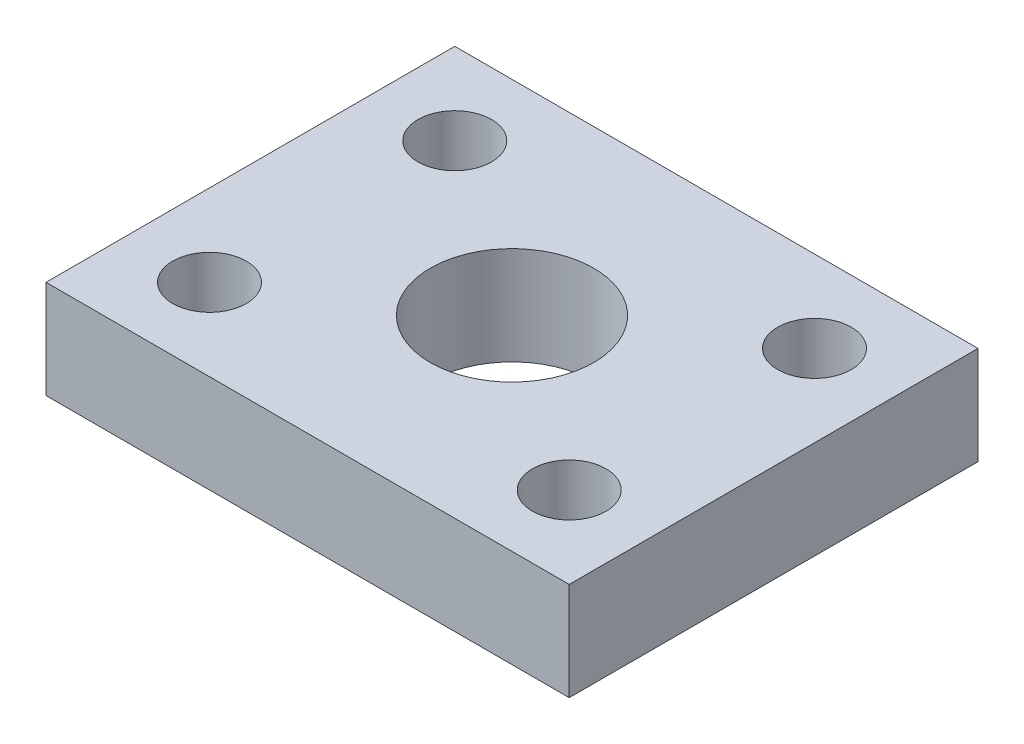
ISO-10303-21;
HEADER;
FILE_DESCRIPTION(('STEP AP214'),'2;1');
FILE_NAME('part.step','',(''),(''),'','','');
FILE_SCHEMA(('AUTOMOTIVE_DESIGN { 1 0 10303 214 1 1 1 1 }'));
ENDSEC;
DATA;
#1=APPLICATION_CONTEXT('core data for automotive mechanical design processes');
#2=APPLICATION_PROTOCOL_DEFINITION('international standard','automotive_design',2000,#1);
#3=PRODUCT_CONTEXT('',#1,'mechanical');
#4=PRODUCT('Part','Part','',(#3));
#5=PRODUCT_RELATED_PRODUCT_CATEGORY('part','',(#4));
#6=PRODUCT_DEFINITION_FORMATION('','',#4);
#7=PRODUCT_DEFINITION_CONTEXT('part definition',#1,'design');
#8=PRODUCT_DEFINITION('design','',#6,#7);
#9=PRODUCT_DEFINITION_SHAPE('','',#8);
#10=(LENGTH_UNIT() NAMED_UNIT(*) SI_UNIT(.MILLI.,.METRE.));
#11=(NAMED_UNIT(*) PLANE_ANGLE_UNIT() SI_UNIT($,.RADIAN.));
#12=(NAMED_UNIT(*) SI_UNIT($,.STERADIAN.) SOLID_ANGLE_UNIT());
#13=UNCERTAINTY_MEASURE_WITH_UNIT(LENGTH_MEASURE(1.E-05),#10,'distance_accuracy_value','');
#14=(GEOMETRIC_REPRESENTATION_CONTEXT(3) GLOBAL_UNCERTAINTY_ASSIGNED_CONTEXT((#13)) GLOBAL_UNIT_ASSIGNED_CONTEXT((#10,
#11,#12)) REPRESENTATION_CONTEXT('',''));
#15=CARTESIAN_POINT('',(0.,0.,0.));
#16=DIRECTION('',(0.,0.,1.));
#17=DIRECTION('',(1.,0.,0.));
#18=AXIS2_PLACEMENT_3D('',#15,#16,#17);
#19=CARTESIAN_POINT('',(0.,6.,0.));
#20=DIRECTION('',(0.,1.,0.));
#21=DIRECTION('',(0.,0.,1.));
#22=AXIS2_PLACEMENT_3D('',#19,#20,#21);
#23=PLANE('',#22);
#24=CARTESIAN_POINT('',(-11.,6.,-7.5));
#25=DIRECTION('',(0.,1.,0.));
#26=DIRECTION('',(0.,0.,1.));
#27=AXIS2_PLACEMENT_3D('',#24,#25,#26);
#28=CIRCLE('',#27,2.25);
#29=CARTESIAN_POINT('',(-11.,6.,-5.25));
#30=VERTEX_POINT('',#29);
#31=EDGE_CURVE('E127',#30,#30,#28,.T.);
#32=ORIENTED_EDGE('',*,*,#31,.F.);
#33=EDGE_LOOP('',(#32));
#34=FACE_BOUND('',#33,.T.);
#35=CARTESIAN_POINT('',(11.,6.,7.5));
#36=DIRECTION('',(0.,1.,0.));
#37=DIRECTION('',(0.,0.,1.));
#38=AXIS2_PLACEMENT_3D('',#35,#36,#37);
#39=CIRCLE('',#38,2.25);
#40=CARTESIAN_POINT('',(11.,6.,9.75));
#41=VERTEX_POINT('',#40);
#42=EDGE_CURVE('E115',#41,#41,#39,.T.);
#43=ORIENTED_EDGE('',*,*,#42,.F.);
#44=EDGE_LOOP('',(#43));
#45=FACE_BOUND('',#44,.T.);
#46=DIRECTION('',(0.,0.,1.));
#47=VECTOR('',#46,1.);
#48=CARTESIAN_POINT('',(-16.,6.,-12.5));
#49=LINE('',#48,#47);
#50=CARTESIAN_POINT('',(-16.,6.,-12.5));
#51=VERTEX_POINT('',#50);
#52=CARTESIAN_POINT('',(-16.,6.,12.5));
#53=VERTEX_POINT('',#52);
#54=EDGE_CURVE('E85',#51,#53,#49,.T.);
#55=ORIENTED_EDGE('',*,*,#54,.T.);
#56=DIRECTION('',(1.,0.,0.));
#57=VECTOR('',#56,1.);
#58=CARTESIAN_POINT('',(-16.,6.,12.5));
#59=LINE('',#58,#57);
#60=CARTESIAN_POINT('',(16.0000000000001,6.,12.5));
#61=VERTEX_POINT('',#60);
#62=EDGE_CURVE('E80',#53,#61,#59,.T.);
#63=ORIENTED_EDGE('',*,*,#62,.T.);
#64=DIRECTION('',(0.,0.,-1.));
#65=VECTOR('',#64,1.);
#66=CARTESIAN_POINT('',(16.,6.,-12.5));
#67=LINE('',#66,#65);
#68=CARTESIAN_POINT('',(16.,6.,-12.5));
#69=VERTEX_POINT('',#68);
#70=EDGE_CURVE('E83',#61,#69,#67,.T.);
#71=ORIENTED_EDGE('',*,*,#70,.T.);
#72=DIRECTION('',(-1.,0.,0.));
#73=VECTOR('',#72,1.);
#74=CARTESIAN_POINT('',(-16.,6.,-12.5));
#75=LINE('',#74,#73);
#76=EDGE_CURVE('E50',#69,#51,#75,.T.);
#77=ORIENTED_EDGE('',*,*,#76,.T.);
#78=EDGE_LOOP('',(#55,#63,#71,#77));
#79=FACE_BOUND('',#78,.T.);
#80=CARTESIAN_POINT('',(11.,6.,-7.5));
#81=DIRECTION('',(0.,1.,0.));
#82=DIRECTION('',(0.,0.,1.));
#83=AXIS2_PLACEMENT_3D('',#80,#81,#82);
#84=CIRCLE('',#83,2.25);
#85=CARTESIAN_POINT('',(11.,6.,-5.25));
#86=VERTEX_POINT('',#85);
#87=EDGE_CURVE('E100',#86,#86,#84,.T.);
#88=ORIENTED_EDGE('',*,*,#87,.F.);
#89=EDGE_LOOP('',(#88));
#90=FACE_BOUND('',#89,.T.);
#91=CARTESIAN_POINT('',(-11.,6.,7.5));
#92=DIRECTION('',(0.,1.,0.));
#93=DIRECTION('',(0.,0.,1.));
#94=AXIS2_PLACEMENT_3D('',#91,#92,#93);
#95=CIRCLE('',#94,2.25);
#96=CARTESIAN_POINT('',(-11.,6.,9.75));
#97=VERTEX_POINT('',#96);
#98=EDGE_CURVE('E121',#97,#97,#95,.T.);
#99=ORIENTED_EDGE('',*,*,#98,.F.);
#100=EDGE_LOOP('',(#99));
#101=FACE_BOUND('',#100,.T.);
#102=CARTESIAN_POINT('',(0.,6.,0.));
#103=DIRECTION('',(0.,1.,0.));
#104=DIRECTION('',(0.,0.,1.));
#105=AXIS2_PLACEMENT_3D('',#102,#103,#104);
#106=CIRCLE('',#105,5.);
#107=CARTESIAN_POINT('',(0.,6.,4.99999999999997));
#108=VERTEX_POINT('',#107);
#109=EDGE_CURVE('E133',#108,#108,#106,.T.);
#110=ORIENTED_EDGE('',*,*,#109,.F.);
#111=EDGE_LOOP('',(#110));
#112=FACE_BOUND('',#111,.T.);
#113=ADVANCED_FACE('F33',(#34,#45,#79,#90,#101,#112),#23,.T.);
#114=CARTESIAN_POINT('',(0.,0.,0.));
#115=DIRECTION('',(0.,1.,0.));
#116=DIRECTION('',(0.,0.,1.));
#117=AXIS2_PLACEMENT_3D('',#114,#115,#116);
#118=PLANE('',#117);
#119=CARTESIAN_POINT('',(-11.,0.,-7.5));
#120=DIRECTION('',(0.,1.,0.));
#121=DIRECTION('',(0.,0.,1.));
#122=AXIS2_PLACEMENT_3D('',#119,#120,#121);
#123=CIRCLE('',#122,2.25);
#124=CARTESIAN_POINT('',(-11.,0.,-5.25));
#125=VERTEX_POINT('',#124);
#126=EDGE_CURVE('E130',#125,#125,#123,.T.);
#127=ORIENTED_EDGE('',*,*,#126,.T.);
#128=EDGE_LOOP('',(#127));
#129=FACE_BOUND('',#128,.T.);
#130=CARTESIAN_POINT('',(11.,0.,7.5));
#131=DIRECTION('',(0.,1.,0.));
#132=DIRECTION('',(0.,0.,1.));
#133=AXIS2_PLACEMENT_3D('',#130,#131,#132);
#134=CIRCLE('',#133,2.25);
#135=CARTESIAN_POINT('',(11.,0.,9.75));
#136=VERTEX_POINT('',#135);
#137=EDGE_CURVE('E118',#136,#136,#134,.T.);
#138=ORIENTED_EDGE('',*,*,#137,.T.);
#139=EDGE_LOOP('',(#138));
#140=FACE_BOUND('',#139,.T.);
#141=DIRECTION('',(0.,0.,1.));
#142=VECTOR('',#141,1.);
#143=CARTESIAN_POINT('',(-16.,0.,-12.5));
#144=LINE('',#143,#142);
#145=CARTESIAN_POINT('',(-16.,0.,-12.5));
#146=VERTEX_POINT('',#145);
#147=CARTESIAN_POINT('',(-16.,0.,12.5));
#148=VERTEX_POINT('',#147);
#149=EDGE_CURVE('E97',#146,#148,#144,.T.);
#150=ORIENTED_EDGE('',*,*,#149,.F.);
#151=DIRECTION('',(-1.,0.,0.));
#152=VECTOR('',#151,1.);
#153=CARTESIAN_POINT('',(-16.,0.,-12.5));
#154=LINE('',#153,#152);
#155=CARTESIAN_POINT('',(16.,0.,-12.5));
#156=VERTEX_POINT('',#155);
#157=EDGE_CURVE('E73',#156,#146,#154,.T.);
#158=ORIENTED_EDGE('',*,*,#157,.F.);
#159=DIRECTION('',(0.,0.,-1.));
#160=VECTOR('',#159,1.);
#161=CARTESIAN_POINT('',(16.,0.,-12.5));
#162=LINE('',#161,#160);
#163=CARTESIAN_POINT('',(16.0000000000001,0.,12.5));
#164=VERTEX_POINT('',#163);
#165=EDGE_CURVE('E67',#164,#156,#162,.T.);
#166=ORIENTED_EDGE('',*,*,#165,.F.);
#167=DIRECTION('',(1.,0.,0.));
#168=VECTOR('',#167,1.);
#169=CARTESIAN_POINT('',(-16.,0.,12.5));
#170=LINE('',#169,#168);
#171=EDGE_CURVE('E89',#148,#164,#170,.T.);
#172=ORIENTED_EDGE('',*,*,#171,.F.);
#173=EDGE_LOOP('',(#150,#158,#166,#172));
#174=FACE_BOUND('',#173,.T.);
#175=CARTESIAN_POINT('',(11.,0.,-7.5));
#176=DIRECTION('',(0.,1.,0.));
#177=DIRECTION('',(0.,0.,1.));
#178=AXIS2_PLACEMENT_3D('',#175,#176,#177);
#179=CIRCLE('',#178,2.25);
#180=CARTESIAN_POINT('',(11.,0.,-5.25));
#181=VERTEX_POINT('',#180);
#182=EDGE_CURVE('E112',#181,#181,#179,.T.);
#183=ORIENTED_EDGE('',*,*,#182,.T.);
#184=EDGE_LOOP('',(#183));
#185=FACE_BOUND('',#184,.T.);
#186=CARTESIAN_POINT('',(-11.,0.,7.5));
#187=DIRECTION('',(0.,1.,0.));
#188=DIRECTION('',(0.,0.,1.));
#189=AXIS2_PLACEMENT_3D('',#186,#187,#188);
#190=CIRCLE('',#189,2.25);
#191=CARTESIAN_POINT('',(-11.,0.,9.75));
#192=VERTEX_POINT('',#191);
#193=EDGE_CURVE('E124',#192,#192,#190,.T.);
#194=ORIENTED_EDGE('',*,*,#193,.T.);
#195=EDGE_LOOP('',(#194));
#196=FACE_BOUND('',#195,.T.);
#197=CARTESIAN_POINT('',(0.,0.,0.));
#198=DIRECTION('',(0.,1.,0.));
#199=DIRECTION('',(0.,0.,1.));
#200=AXIS2_PLACEMENT_3D('',#197,#198,#199);
#201=CIRCLE('',#200,5.);
#202=CARTESIAN_POINT('',(0.,0.,4.99999999999997));
#203=VERTEX_POINT('',#202);
#204=EDGE_CURVE('E136',#203,#203,#201,.T.);
#205=ORIENTED_EDGE('',*,*,#204,.T.);
#206=EDGE_LOOP('',(#205));
#207=FACE_BOUND('',#206,.T.);
#208=ADVANCED_FACE('F108',(#129,#140,#174,#185,#196,#207),#118,.F.);
#209=CARTESIAN_POINT('',(-16.,6.,-12.5));
#210=DIRECTION('',(1.,0.,0.));
#211=DIRECTION('',(0.,0.,-1.));
#212=AXIS2_PLACEMENT_3D('',#209,#210,#211);
#213=PLANE('',#212);
#214=ORIENTED_EDGE('',*,*,#149,.T.);
#215=DIRECTION('',(0.,-1.,0.));
#216=VECTOR('',#215,1.);
#217=CARTESIAN_POINT('',(-16.,6.,12.5));
#218=LINE('',#217,#216);
#219=EDGE_CURVE('E11',#53,#148,#218,.T.);
#220=ORIENTED_EDGE('',*,*,#219,.F.);
#221=ORIENTED_EDGE('',*,*,#54,.F.);
#222=DIRECTION('',(0.,-1.,0.));
#223=VECTOR('',#222,1.);
#224=CARTESIAN_POINT('',(-16.,6.,-12.5));
#225=LINE('',#224,#223);
#226=EDGE_CURVE('E93',#51,#146,#225,.T.);
#227=ORIENTED_EDGE('',*,*,#226,.T.);
#228=EDGE_LOOP('',(#214,#220,#221,#227));
#229=FACE_BOUND('',#228,.T.);
#230=ADVANCED_FACE('F35',(#229),#213,.F.);
#231=CARTESIAN_POINT('',(-16.,6.,12.5));
#232=DIRECTION('',(0.,0.,-1.));
#233=DIRECTION('',(-1.,0.,0.));
#234=AXIS2_PLACEMENT_3D('',#231,#232,#233);
#235=PLANE('',#234);
#236=ORIENTED_EDGE('',*,*,#171,.T.);
#237=DIRECTION('',(0.,-1.,0.));
#238=VECTOR('',#237,1.);
#239=CARTESIAN_POINT('',(16.0000000000001,6.,12.5));
#240=LINE('',#239,#238);
#241=EDGE_CURVE('E42',#61,#164,#240,.T.);
#242=ORIENTED_EDGE('',*,*,#241,.F.);
#243=ORIENTED_EDGE('',*,*,#62,.F.);
#244=ORIENTED_EDGE('',*,*,#219,.T.);
#245=EDGE_LOOP('',(#236,#242,#243,#244));
#246=FACE_BOUND('',#245,.T.);
#247=ADVANCED_FACE('F88',(#246),#235,.F.);
#248=CARTESIAN_POINT('',(16.,6.,-12.5));
#249=DIRECTION('',(-1.,0.,0.));
#250=DIRECTION('',(0.,0.,1.));
#251=AXIS2_PLACEMENT_3D('',#248,#249,#250);
#252=PLANE('',#251);
#253=ORIENTED_EDGE('',*,*,#165,.T.);
#254=DIRECTION('',(0.,-1.,0.));
#255=VECTOR('',#254,1.);
#256=CARTESIAN_POINT('',(16.,6.,-12.5));
#257=LINE('',#256,#255);
#258=EDGE_CURVE('E90',#69,#156,#257,.T.);
#259=ORIENTED_EDGE('',*,*,#258,.F.);
#260=ORIENTED_EDGE('',*,*,#70,.F.);
#261=ORIENTED_EDGE('',*,*,#241,.T.);
#262=EDGE_LOOP('',(#253,#259,#260,#261));
#263=FACE_BOUND('',#262,.T.);
#264=ADVANCED_FACE('F91',(#263),#252,.F.);
#265=CARTESIAN_POINT('',(-16.,6.,-12.5));
#266=DIRECTION('',(0.,0.,1.));
#267=DIRECTION('',(1.,0.,0.));
#268=AXIS2_PLACEMENT_3D('',#265,#266,#267);
#269=PLANE('',#268);
#270=ORIENTED_EDGE('',*,*,#157,.T.);
#271=ORIENTED_EDGE('',*,*,#226,.F.);
#272=ORIENTED_EDGE('',*,*,#76,.F.);
#273=ORIENTED_EDGE('',*,*,#258,.T.);
#274=EDGE_LOOP('',(#270,#271,#272,#273));
#275=FACE_BOUND('',#274,.T.);
#276=ADVANCED_FACE('F105',(#275),#269,.F.);
#277=CARTESIAN_POINT('',(11.,6.,-7.5));
#278=DIRECTION('',(0.,-1.,0.));
#279=DIRECTION('',(0.,0.,-1.));
#280=AXIS2_PLACEMENT_3D('',#277,#278,#279);
#281=CYLINDRICAL_SURFACE('',#280,2.25);
#282=ORIENTED_EDGE('',*,*,#87,.T.);
#283=EDGE_LOOP('',(#282));
#284=FACE_BOUND('',#283,.T.);
#285=ORIENTED_EDGE('',*,*,#182,.F.);
#286=EDGE_LOOP('',(#285));
#287=FACE_BOUND('',#286,.T.);
#288=ADVANCED_FACE('F156',(#284,#287),#281,.F.);
#289=CARTESIAN_POINT('',(11.,6.,7.5));
#290=DIRECTION('',(0.,-1.,0.));
#291=DIRECTION('',(0.,0.,-1.));
#292=AXIS2_PLACEMENT_3D('',#289,#290,#291);
#293=CYLINDRICAL_SURFACE('',#292,2.25);
#294=ORIENTED_EDGE('',*,*,#42,.T.);
#295=EDGE_LOOP('',(#294));
#296=FACE_BOUND('',#295,.T.);
#297=ORIENTED_EDGE('',*,*,#137,.F.);
#298=EDGE_LOOP('',(#297));
#299=FACE_BOUND('',#298,.T.);
#300=ADVANCED_FACE('F202',(#296,#299),#293,.F.);
#301=CARTESIAN_POINT('',(-11.,6.,7.5));
#302=DIRECTION('',(0.,-1.,0.));
#303=DIRECTION('',(0.,0.,-1.));
#304=AXIS2_PLACEMENT_3D('',#301,#302,#303);
#305=CYLINDRICAL_SURFACE('',#304,2.25);
#306=ORIENTED_EDGE('',*,*,#98,.T.);
#307=EDGE_LOOP('',(#306));
#308=FACE_BOUND('',#307,.T.);
#309=ORIENTED_EDGE('',*,*,#193,.F.);
#310=EDGE_LOOP('',(#309));
#311=FACE_BOUND('',#310,.T.);
#312=ADVANCED_FACE('F210',(#308,#311),#305,.F.);
#313=CARTESIAN_POINT('',(-11.,6.,-7.5));
#314=DIRECTION('',(0.,-1.,0.));
#315=DIRECTION('',(0.,0.,-1.));
#316=AXIS2_PLACEMENT_3D('',#313,#314,#315);
#317=CYLINDRICAL_SURFACE('',#316,2.25);
#318=ORIENTED_EDGE('',*,*,#31,.T.);
#319=EDGE_LOOP('',(#318));
#320=FACE_BOUND('',#319,.T.);
#321=ORIENTED_EDGE('',*,*,#126,.F.);
#322=EDGE_LOOP('',(#321));
#323=FACE_BOUND('',#322,.T.);
#324=ADVANCED_FACE('F218',(#320,#323),#317,.F.);
#325=CARTESIAN_POINT('',(0.,6.,0.));
#326=DIRECTION('',(0.,-1.,0.));
#327=DIRECTION('',(0.,0.,-1.));
#328=AXIS2_PLACEMENT_3D('',#325,#326,#327);
#329=CYLINDRICAL_SURFACE('',#328,5.);
#330=ORIENTED_EDGE('',*,*,#109,.T.);
#331=EDGE_LOOP('',(#330));
#332=FACE_BOUND('',#331,.T.);
#333=ORIENTED_EDGE('',*,*,#204,.F.);
#334=EDGE_LOOP('',(#333));
#335=FACE_BOUND('',#334,.T.);
#336=ADVANCED_FACE('F142',(#332,#335),#329,.F.);
#337=CLOSED_SHELL('',(#113,#208,#230,#247,#264,#276,#288,#300,#312,#324,#336));
#338=MANIFOLD_SOLID_BREP('B2',#337);
#339=ADVANCED_BREP_SHAPE_REPRESENTATION('',(#18,#338),#14);
#340=SHAPE_DEFINITION_REPRESENTATION(#9,#339);
ENDSEC;
END-ISO-10303-21;
